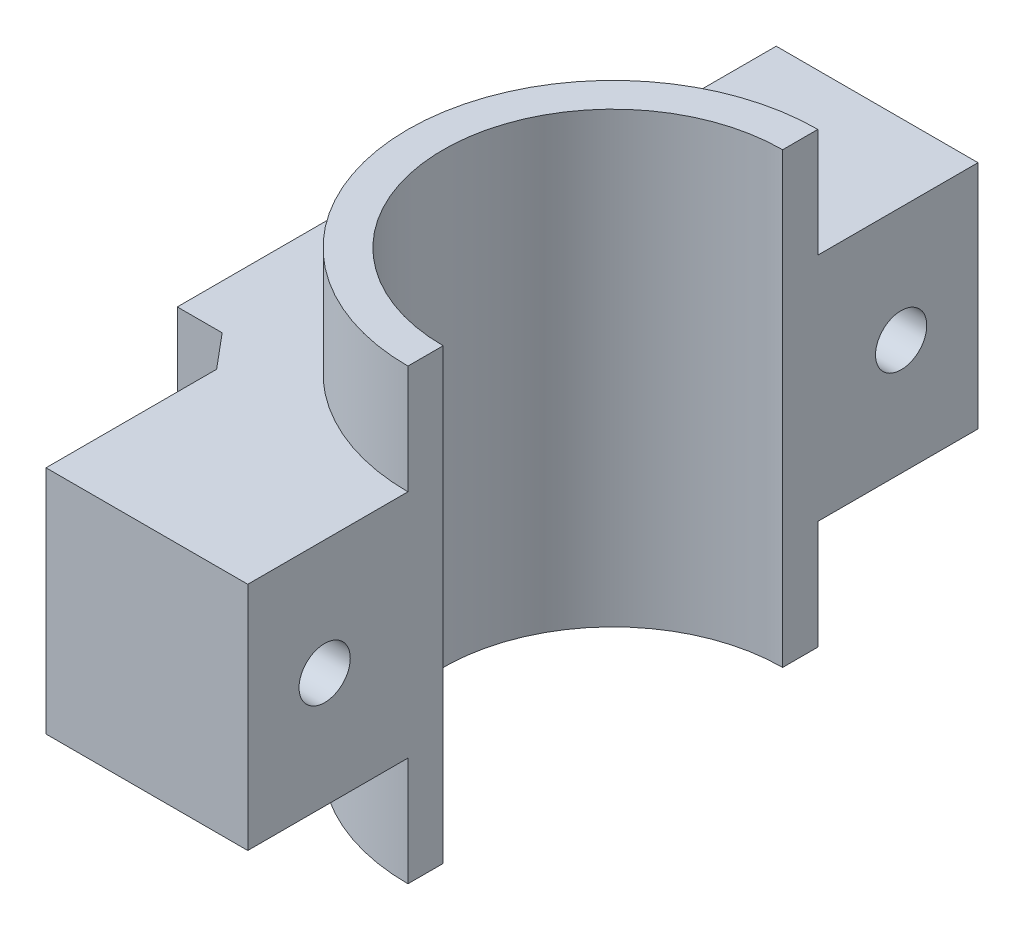
ISO-10303-21;
HEADER;
FILE_DESCRIPTION(('STEP AP214'),'2;1');
FILE_NAME('part.step','',(''),(''),'','','');
FILE_SCHEMA(('AUTOMOTIVE_DESIGN { 1 0 10303 214 1 1 1 1 }'));
ENDSEC;
DATA;
#1=APPLICATION_CONTEXT('core data for automotive mechanical design processes');
#2=APPLICATION_PROTOCOL_DEFINITION('international standard','automotive_design',2000,#1);
#3=PRODUCT_CONTEXT('',#1,'mechanical');
#4=PRODUCT('Part','Part','',(#3));
#5=PRODUCT_RELATED_PRODUCT_CATEGORY('part','',(#4));
#6=PRODUCT_DEFINITION_FORMATION('','',#4);
#7=PRODUCT_DEFINITION_CONTEXT('part definition',#1,'design');
#8=PRODUCT_DEFINITION('design','',#6,#7);
#9=PRODUCT_DEFINITION_SHAPE('','',#8);
#10=(LENGTH_UNIT() NAMED_UNIT(*) SI_UNIT(.MILLI.,.METRE.));
#11=(NAMED_UNIT(*) PLANE_ANGLE_UNIT() SI_UNIT($,.RADIAN.));
#12=(NAMED_UNIT(*) SI_UNIT($,.STERADIAN.) SOLID_ANGLE_UNIT());
#13=UNCERTAINTY_MEASURE_WITH_UNIT(LENGTH_MEASURE(1.E-05),#10,'distance_accuracy_value','');
#14=(GEOMETRIC_REPRESENTATION_CONTEXT(3) GLOBAL_UNCERTAINTY_ASSIGNED_CONTEXT((#13)) GLOBAL_UNIT_ASSIGNED_CONTEXT((#10,
#11,#12)) REPRESENTATION_CONTEXT('',''));
#15=CARTESIAN_POINT('',(0.,0.,0.));
#16=DIRECTION('',(0.,0.,1.));
#17=DIRECTION('',(1.,0.,0.));
#18=AXIS2_PLACEMENT_3D('',#15,#16,#17);
#19=CARTESIAN_POINT('',(0.,18.,0.));
#20=DIRECTION('',(-1.,0.,0.));
#21=DIRECTION('',(0.,0.,1.));
#22=AXIS2_PLACEMENT_3D('',#19,#20,#21);
#23=PLANE('',#22);
#24=DIRECTION('',(0.,0.,-1.));
#25=VECTOR('',#24,1.);
#26=CARTESIAN_POINT('',(0.,-18.,0.));
#27=LINE('',#26,#25);
#28=CARTESIAN_POINT('',(0.,-18.,-32.));
#29=VERTEX_POINT('',#28);
#30=CARTESIAN_POINT('',(0.,-18.,-57.));
#31=VERTEX_POINT('',#30);
#32=EDGE_CURVE('E161',#29,#31,#27,.T.);
#33=ORIENTED_EDGE('',*,*,#32,.T.);
#34=DIRECTION('',(0.,-1.,0.));
#35=VECTOR('',#34,1.);
#36=CARTESIAN_POINT('',(0.,18.,-57.));
#37=LINE('',#36,#35);
#38=CARTESIAN_POINT('',(0.,18.,-57.));
#39=VERTEX_POINT('',#38);
#40=EDGE_CURVE('E11',#39,#31,#37,.T.);
#41=ORIENTED_EDGE('',*,*,#40,.F.);
#42=DIRECTION('',(0.,0.,-1.));
#43=VECTOR('',#42,1.);
#44=CARTESIAN_POINT('',(0.,18.,0.));
#45=LINE('',#44,#43);
#46=CARTESIAN_POINT('',(0.,18.,-32.));
#47=VERTEX_POINT('',#46);
#48=EDGE_CURVE('E459',#47,#39,#45,.T.);
#49=ORIENTED_EDGE('',*,*,#48,.F.);
#50=DIRECTION('',(0.,-1.,0.));
#51=VECTOR('',#50,1.);
#52=CARTESIAN_POINT('',(0.,35.,-32.));
#53=LINE('',#52,#51);
#54=CARTESIAN_POINT('',(0.,35.,-32.));
#55=VERTEX_POINT('',#54);
#56=EDGE_CURVE('E444',#55,#47,#53,.T.);
#57=ORIENTED_EDGE('',*,*,#56,.F.);
#58=DIRECTION('',(0.,0.,-1.));
#59=VECTOR('',#58,1.);
#60=CARTESIAN_POINT('',(0.,35.,0.));
#61=LINE('',#60,#59);
#62=CARTESIAN_POINT('',(0.,35.,-26.5));
#63=VERTEX_POINT('',#62);
#64=EDGE_CURVE('E430',#63,#55,#61,.T.);
#65=ORIENTED_EDGE('',*,*,#64,.F.);
#66=DIRECTION('',(0.,-1.,0.));
#67=VECTOR('',#66,1.);
#68=CARTESIAN_POINT('',(0.,35.,-26.5));
#69=LINE('',#68,#67);
#70=CARTESIAN_POINT('',(0.,-35.,-26.5));
#71=VERTEX_POINT('',#70);
#72=EDGE_CURVE('E447',#63,#71,#69,.T.);
#73=ORIENTED_EDGE('',*,*,#72,.T.);
#74=DIRECTION('',(0.,0.,-1.));
#75=VECTOR('',#74,1.);
#76=CARTESIAN_POINT('',(0.,-35.,0.));
#77=LINE('',#76,#75);
#78=CARTESIAN_POINT('',(0.,-35.,-32.));
#79=VERTEX_POINT('',#78);
#80=EDGE_CURVE('E424',#71,#79,#77,.T.);
#81=ORIENTED_EDGE('',*,*,#80,.T.);
#82=EDGE_CURVE('E433',#29,#79,#53,.T.);
#83=ORIENTED_EDGE('',*,*,#82,.F.);
#84=EDGE_LOOP('',(#33,#41,#49,#57,#65,#73,#81,#83));
#85=FACE_BOUND('',#84,.T.);
#86=CARTESIAN_POINT('',(-1.66533453693773E-13,0.,-45.));
#87=DIRECTION('',(-1.,0.,0.));
#88=DIRECTION('',(0.,0.,1.));
#89=AXIS2_PLACEMENT_3D('',#86,#87,#88);
#90=CIRCLE('',#89,4.00000000000001);
#91=CARTESIAN_POINT('',(-1.51730480032105E-13,0.,-41.));
#92=VERTEX_POINT('',#91);
#93=EDGE_CURVE('E406',#92,#92,#90,.T.);
#94=ORIENTED_EDGE('',*,*,#93,.T.);
#95=EDGE_LOOP('',(#94));
#96=FACE_BOUND('',#95,.T.);
#97=ADVANCED_FACE('F34',(#85,#96),#23,.F.);
#98=CARTESIAN_POINT('',(-31.5004867321942,18.,0.));
#99=DIRECTION('',(1.,0.,0.));
#100=DIRECTION('',(0.,0.,-1.));
#101=AXIS2_PLACEMENT_3D('',#98,#99,#100);
#102=PLANE('',#101);
#103=DIRECTION('',(0.,0.,1.));
#104=VECTOR('',#103,1.);
#105=CARTESIAN_POINT('',(-31.5004867321942,-18.,0.));
#106=LINE('',#105,#104);
#107=CARTESIAN_POINT('',(-31.5004867321942,-18.,-57.));
#108=VERTEX_POINT('',#107);
#109=CARTESIAN_POINT('',(-31.5004867321942,-18.,-30.3623111018329));
#110=VERTEX_POINT('',#109);
#111=EDGE_CURVE('E165',#108,#110,#106,.T.);
#112=ORIENTED_EDGE('',*,*,#111,.T.);
#113=DIRECTION('',(0.,-1.,0.));
#114=VECTOR('',#113,1.);
#115=CARTESIAN_POINT('',(-31.5004867321942,18.,-30.3623111018329));
#116=LINE('',#115,#114);
#117=CARTESIAN_POINT('',(-31.5004867321942,18.,-30.3623111018329));
#118=VERTEX_POINT('',#117);
#119=EDGE_CURVE('E194',#118,#110,#116,.T.);
#120=ORIENTED_EDGE('',*,*,#119,.F.);
#121=DIRECTION('',(0.,0.,1.));
#122=VECTOR('',#121,1.);
#123=CARTESIAN_POINT('',(-31.5004867321942,18.,0.));
#124=LINE('',#123,#122);
#125=CARTESIAN_POINT('',(-31.5004867321942,18.,-57.));
#126=VERTEX_POINT('',#125);
#127=EDGE_CURVE('E203',#126,#118,#124,.T.);
#128=ORIENTED_EDGE('',*,*,#127,.F.);
#129=DIRECTION('',(0.,-1.,0.));
#130=VECTOR('',#129,1.);
#131=CARTESIAN_POINT('',(-31.5004867321942,18.,-57.));
#132=LINE('',#131,#130);
#133=EDGE_CURVE('E43',#126,#108,#132,.T.);
#134=ORIENTED_EDGE('',*,*,#133,.T.);
#135=EDGE_LOOP('',(#112,#120,#128,#134));
#136=FACE_BOUND('',#135,.T.);
#137=CARTESIAN_POINT('',(-31.5004867321942,0.,-44.9999999999999));
#138=DIRECTION('',(1.,0.,0.));
#139=DIRECTION('',(0.,0.,-1.));
#140=AXIS2_PLACEMENT_3D('',#137,#138,#139);
#141=CIRCLE('',#140,4.00000000000001);
#142=CARTESIAN_POINT('',(-31.5004867321942,0.,-48.9999999999999));
#143=VERTEX_POINT('',#142);
#144=EDGE_CURVE('E409',#143,#143,#141,.T.);
#145=ORIENTED_EDGE('',*,*,#144,.T.);
#146=EDGE_LOOP('',(#145));
#147=FACE_BOUND('',#146,.T.);
#148=ADVANCED_FACE('F200',(#136,#147),#102,.F.);
#149=CARTESIAN_POINT('',(0.,18.,0.));
#150=DIRECTION('',(1.,0.,0.));
#151=DIRECTION('',(0.,0.,-1.));
#152=AXIS2_PLACEMENT_3D('',#149,#150,#151);
#153=PLANE('',#152);
#154=CARTESIAN_POINT('',(-1.66533453693773E-13,0.,45.));
#155=DIRECTION('',(1.,0.,0.));
#156=DIRECTION('',(0.,0.,-1.));
#157=AXIS2_PLACEMENT_3D('',#154,#155,#156);
#158=CIRCLE('',#157,4.00000000000001);
#159=CARTESIAN_POINT('',(-1.51730480032105E-13,0.,41.));
#160=VERTEX_POINT('',#159);
#161=EDGE_CURVE('E414',#160,#160,#158,.T.);
#162=ORIENTED_EDGE('',*,*,#161,.F.);
#163=EDGE_LOOP('',(#162));
#164=FACE_BOUND('',#163,.T.);
#165=DIRECTION('',(0.,0.,1.));
#166=VECTOR('',#165,1.);
#167=CARTESIAN_POINT('',(0.,-18.,0.));
#168=LINE('',#167,#166);
#169=CARTESIAN_POINT('',(0.,-18.,32.));
#170=VERTEX_POINT('',#169);
#171=CARTESIAN_POINT('',(0.,-18.,57.));
#172=VERTEX_POINT('',#171);
#173=EDGE_CURVE('E155',#170,#172,#168,.T.);
#174=ORIENTED_EDGE('',*,*,#173,.F.);
#175=DIRECTION('',(0.,-1.,0.));
#176=VECTOR('',#175,1.);
#177=CARTESIAN_POINT('',(0.,35.,32.));
#178=LINE('',#177,#176);
#179=CARTESIAN_POINT('',(0.,-35.,32.));
#180=VERTEX_POINT('',#179);
#181=EDGE_CURVE('E453',#170,#180,#178,.T.);
#182=ORIENTED_EDGE('',*,*,#181,.T.);
#183=DIRECTION('',(0.,0.,1.));
#184=VECTOR('',#183,1.);
#185=CARTESIAN_POINT('',(0.,-35.,0.));
#186=LINE('',#185,#184);
#187=CARTESIAN_POINT('',(0.,-35.,26.5));
#188=VERTEX_POINT('',#187);
#189=EDGE_CURVE('E436',#188,#180,#186,.T.);
#190=ORIENTED_EDGE('',*,*,#189,.F.);
#191=DIRECTION('',(0.,-1.,0.));
#192=VECTOR('',#191,1.);
#193=CARTESIAN_POINT('',(0.,35.,26.5));
#194=LINE('',#193,#192);
#195=CARTESIAN_POINT('',(0.,35.,26.5));
#196=VERTEX_POINT('',#195);
#197=EDGE_CURVE('E450',#196,#188,#194,.T.);
#198=ORIENTED_EDGE('',*,*,#197,.F.);
#199=DIRECTION('',(0.,0.,1.));
#200=VECTOR('',#199,1.);
#201=CARTESIAN_POINT('',(0.,35.,0.));
#202=LINE('',#201,#200);
#203=CARTESIAN_POINT('',(0.,35.,32.));
#204=VERTEX_POINT('',#203);
#205=EDGE_CURVE('E423',#196,#204,#202,.T.);
#206=ORIENTED_EDGE('',*,*,#205,.T.);
#207=CARTESIAN_POINT('',(0.,18.,32.));
#208=VERTEX_POINT('',#207);
#209=EDGE_CURVE('E158',#204,#208,#178,.T.);
#210=ORIENTED_EDGE('',*,*,#209,.T.);
#211=DIRECTION('',(0.,0.,1.));
#212=VECTOR('',#211,1.);
#213=CARTESIAN_POINT('',(0.,18.,0.));
#214=LINE('',#213,#212);
#215=CARTESIAN_POINT('',(0.,18.,57.));
#216=VERTEX_POINT('',#215);
#217=EDGE_CURVE('E99',#208,#216,#214,.T.);
#218=ORIENTED_EDGE('',*,*,#217,.T.);
#219=DIRECTION('',(0.,-1.,0.));
#220=VECTOR('',#219,1.);
#221=CARTESIAN_POINT('',(0.,18.,57.));
#222=LINE('',#221,#220);
#223=EDGE_CURVE('E51',#216,#172,#222,.T.);
#224=ORIENTED_EDGE('',*,*,#223,.T.);
#225=EDGE_LOOP('',(#174,#182,#190,#198,#206,#210,#218,#224));
#226=FACE_BOUND('',#225,.T.);
#227=ADVANCED_FACE('F36',(#164,#226),#153,.T.);
#228=CARTESIAN_POINT('',(0.,18.,-57.));
#229=DIRECTION('',(0.,0.,1.));
#230=DIRECTION('',(1.,0.,0.));
#231=AXIS2_PLACEMENT_3D('',#228,#229,#230);
#232=PLANE('',#231);
#233=DIRECTION('',(-1.,0.,0.));
#234=VECTOR('',#233,1.);
#235=CARTESIAN_POINT('',(0.,-18.,-57.));
#236=LINE('',#235,#234);
#237=EDGE_CURVE('E163',#31,#108,#236,.T.);
#238=ORIENTED_EDGE('',*,*,#237,.T.);
#239=ORIENTED_EDGE('',*,*,#133,.F.);
#240=DIRECTION('',(-1.,0.,0.));
#241=VECTOR('',#240,1.);
#242=CARTESIAN_POINT('',(0.,18.,-57.));
#243=LINE('',#242,#241);
#244=EDGE_CURVE('E223',#39,#126,#243,.T.);
#245=ORIENTED_EDGE('',*,*,#244,.F.);
#246=ORIENTED_EDGE('',*,*,#40,.T.);
#247=EDGE_LOOP('',(#238,#239,#245,#246));
#248=FACE_BOUND('',#247,.T.);
#249=ADVANCED_FACE('F252',(#248),#232,.F.);
#250=CARTESIAN_POINT('',(-33.4357641106574,18.,-28.0559373333831));
#251=DIRECTION('',(-0.766044443118979,0.,-0.642787609686538));
#252=DIRECTION('',(-0.642787609686538,0.,0.766044443118979));
#253=AXIS2_PLACEMENT_3D('',#250,#251,#252);
#254=PLANE('',#253);
#255=DIRECTION('',(0.642787609686538,0.,-0.766044443118979));
#256=VECTOR('',#255,1.);
#257=CARTESIAN_POINT('',(-33.4357641106574,-18.,-28.0559373333831));
#258=LINE('',#257,#256);
#259=CARTESIAN_POINT('',(-36.,-18.,-25.));
#260=VERTEX_POINT('',#259);
#261=EDGE_CURVE('E168',#260,#110,#258,.T.);
#262=ORIENTED_EDGE('',*,*,#261,.F.);
#263=DIRECTION('',(0.,-1.,0.));
#264=VECTOR('',#263,1.);
#265=CARTESIAN_POINT('',(-36.,18.,-25.));
#266=LINE('',#265,#264);
#267=CARTESIAN_POINT('',(-36.,18.,-25.));
#268=VERTEX_POINT('',#267);
#269=EDGE_CURVE('E192',#268,#260,#266,.T.);
#270=ORIENTED_EDGE('',*,*,#269,.F.);
#271=DIRECTION('',(0.642787609686538,0.,-0.766044443118979));
#272=VECTOR('',#271,1.);
#273=CARTESIAN_POINT('',(-33.4357641106574,18.,-28.0559373333831));
#274=LINE('',#273,#272);
#275=EDGE_CURVE('E216',#268,#118,#274,.T.);
#276=ORIENTED_EDGE('',*,*,#275,.T.);
#277=ORIENTED_EDGE('',*,*,#119,.T.);
#278=EDGE_LOOP('',(#262,#270,#276,#277));
#279=FACE_BOUND('',#278,.T.);
#280=ADVANCED_FACE('F213',(#279),#254,.T.);
#281=CARTESIAN_POINT('',(0.,18.,-25.));
#282=DIRECTION('',(0.,0.,-1.));
#283=DIRECTION('',(-1.,0.,0.));
#284=AXIS2_PLACEMENT_3D('',#281,#282,#283);
#285=PLANE('',#284);
#286=DIRECTION('',(1.,0.,0.));
#287=VECTOR('',#286,1.);
#288=CARTESIAN_POINT('',(0.,-18.,-25.));
#289=LINE('',#288,#287);
#290=CARTESIAN_POINT('',(-43.,-18.,-25.));
#291=VERTEX_POINT('',#290);
#292=EDGE_CURVE('E171',#291,#260,#289,.T.);
#293=ORIENTED_EDGE('',*,*,#292,.F.);
#294=DIRECTION('',(0.,-1.,0.));
#295=VECTOR('',#294,1.);
#296=CARTESIAN_POINT('',(-43.,18.,-25.));
#297=LINE('',#296,#295);
#298=CARTESIAN_POINT('',(-43.,18.,-25.));
#299=VERTEX_POINT('',#298);
#300=EDGE_CURVE('E190',#299,#291,#297,.T.);
#301=ORIENTED_EDGE('',*,*,#300,.F.);
#302=DIRECTION('',(1.,0.,0.));
#303=VECTOR('',#302,1.);
#304=CARTESIAN_POINT('',(0.,18.,-25.));
#305=LINE('',#304,#303);
#306=EDGE_CURVE('E219',#299,#268,#305,.T.);
#307=ORIENTED_EDGE('',*,*,#306,.T.);
#308=ORIENTED_EDGE('',*,*,#269,.T.);
#309=EDGE_LOOP('',(#293,#301,#307,#308));
#310=FACE_BOUND('',#309,.T.);
#311=ADVANCED_FACE('F232',(#310),#285,.T.);
#312=CARTESIAN_POINT('',(-43.,18.,0.));
#313=DIRECTION('',(-1.,0.,0.));
#314=DIRECTION('',(0.,0.,1.));
#315=AXIS2_PLACEMENT_3D('',#312,#313,#314);
#316=PLANE('',#315);
#317=DIRECTION('',(0.,0.,-1.));
#318=VECTOR('',#317,1.);
#319=CARTESIAN_POINT('',(-43.,-18.,0.));
#320=LINE('',#319,#318);
#321=CARTESIAN_POINT('',(-43.,-18.,25.));
#322=VERTEX_POINT('',#321);
#323=EDGE_CURVE('E174',#322,#291,#320,.T.);
#324=ORIENTED_EDGE('',*,*,#323,.F.);
#325=DIRECTION('',(0.,-1.,0.));
#326=VECTOR('',#325,1.);
#327=CARTESIAN_POINT('',(-43.,18.,25.));
#328=LINE('',#327,#326);
#329=CARTESIAN_POINT('',(-43.,18.,25.));
#330=VERTEX_POINT('',#329);
#331=EDGE_CURVE('E188',#330,#322,#328,.T.);
#332=ORIENTED_EDGE('',*,*,#331,.F.);
#333=DIRECTION('',(0.,0.,-1.));
#334=VECTOR('',#333,1.);
#335=CARTESIAN_POINT('',(-43.,18.,0.));
#336=LINE('',#335,#334);
#337=EDGE_CURVE('E221',#330,#299,#336,.T.);
#338=ORIENTED_EDGE('',*,*,#337,.T.);
#339=ORIENTED_EDGE('',*,*,#300,.T.);
#340=EDGE_LOOP('',(#324,#332,#338,#339));
#341=FACE_BOUND('',#340,.T.);
#342=ADVANCED_FACE('F230',(#341),#316,.T.);
#343=CARTESIAN_POINT('',(0.,18.,25.));
#344=DIRECTION('',(0.,0.,-1.));
#345=DIRECTION('',(-1.,0.,0.));
#346=AXIS2_PLACEMENT_3D('',#343,#344,#345);
#347=PLANE('',#346);
#348=DIRECTION('',(1.,0.,0.));
#349=VECTOR('',#348,1.);
#350=CARTESIAN_POINT('',(0.,-18.,25.));
#351=LINE('',#350,#349);
#352=CARTESIAN_POINT('',(-36.,-18.,25.));
#353=VERTEX_POINT('',#352);
#354=EDGE_CURVE('E177',#322,#353,#351,.T.);
#355=ORIENTED_EDGE('',*,*,#354,.T.);
#356=DIRECTION('',(0.,-1.,0.));
#357=VECTOR('',#356,1.);
#358=CARTESIAN_POINT('',(-36.,18.,25.));
#359=LINE('',#358,#357);
#360=CARTESIAN_POINT('',(-36.,18.,25.));
#361=VERTEX_POINT('',#360);
#362=EDGE_CURVE('E147',#361,#353,#359,.T.);
#363=ORIENTED_EDGE('',*,*,#362,.F.);
#364=DIRECTION('',(1.,0.,0.));
#365=VECTOR('',#364,1.);
#366=CARTESIAN_POINT('',(0.,18.,25.));
#367=LINE('',#366,#365);
#368=EDGE_CURVE('E135',#330,#361,#367,.T.);
#369=ORIENTED_EDGE('',*,*,#368,.F.);
#370=ORIENTED_EDGE('',*,*,#331,.T.);
#371=EDGE_LOOP('',(#355,#363,#369,#370));
#372=FACE_BOUND('',#371,.T.);
#373=ADVANCED_FACE('F235',(#372),#347,.F.);
#374=CARTESIAN_POINT('',(-33.4357641106574,18.,28.0559373333831));
#375=DIRECTION('',(0.766044443118979,0.,-0.642787609686538));
#376=DIRECTION('',(-0.642787609686538,0.,-0.766044443118979));
#377=AXIS2_PLACEMENT_3D('',#374,#375,#376);
#378=PLANE('',#377);
#379=DIRECTION('',(0.642787609686538,0.,0.766044443118979));
#380=VECTOR('',#379,1.);
#381=CARTESIAN_POINT('',(-33.4357641106574,-18.,28.0559373333831));
#382=LINE('',#381,#380);
#383=CARTESIAN_POINT('',(-31.5004867321943,-18.,30.3623111018329));
#384=VERTEX_POINT('',#383);
#385=EDGE_CURVE('E144',#353,#384,#382,.T.);
#386=ORIENTED_EDGE('',*,*,#385,.T.);
#387=DIRECTION('',(0.,-1.,0.));
#388=VECTOR('',#387,1.);
#389=CARTESIAN_POINT('',(-31.5004867321943,18.,30.3623111018329));
#390=LINE('',#389,#388);
#391=CARTESIAN_POINT('',(-31.5004867321943,18.,30.3623111018329));
#392=VERTEX_POINT('',#391);
#393=EDGE_CURVE('E141',#392,#384,#390,.T.);
#394=ORIENTED_EDGE('',*,*,#393,.F.);
#395=DIRECTION('',(0.642787609686538,0.,0.766044443118979));
#396=VECTOR('',#395,1.);
#397=CARTESIAN_POINT('',(-33.4357641106574,18.,28.0559373333831));
#398=LINE('',#397,#396);
#399=EDGE_CURVE('E128',#361,#392,#398,.T.);
#400=ORIENTED_EDGE('',*,*,#399,.F.);
#401=ORIENTED_EDGE('',*,*,#362,.T.);
#402=EDGE_LOOP('',(#386,#394,#400,#401));
#403=FACE_BOUND('',#402,.T.);
#404=ADVANCED_FACE('F142',(#403),#378,.F.);
#405=CARTESIAN_POINT('',(-31.5004867321943,18.,0.));
#406=DIRECTION('',(-1.,0.,0.));
#407=DIRECTION('',(0.,0.,1.));
#408=AXIS2_PLACEMENT_3D('',#405,#406,#407);
#409=PLANE('',#408);
#410=CARTESIAN_POINT('',(-31.5004867321942,0.,44.9999999999999));
#411=DIRECTION('',(-1.,0.,0.));
#412=DIRECTION('',(0.,0.,1.));
#413=AXIS2_PLACEMENT_3D('',#410,#411,#412);
#414=CIRCLE('',#413,4.00000000000001);
#415=CARTESIAN_POINT('',(-31.5004867321942,0.,48.9999999999999));
#416=VERTEX_POINT('',#415);
#417=EDGE_CURVE('E411',#416,#416,#414,.F.);
#418=ORIENTED_EDGE('',*,*,#417,.T.);
#419=EDGE_LOOP('',(#418));
#420=FACE_BOUND('',#419,.T.);
#421=DIRECTION('',(0.,0.,-1.));
#422=VECTOR('',#421,1.);
#423=CARTESIAN_POINT('',(-31.5004867321943,-18.,0.));
#424=LINE('',#423,#422);
#425=CARTESIAN_POINT('',(-31.5004867321942,-18.,57.));
#426=VERTEX_POINT('',#425);
#427=EDGE_CURVE('E180',#426,#384,#424,.T.);
#428=ORIENTED_EDGE('',*,*,#427,.F.);
#429=DIRECTION('',(0.,-1.,0.));
#430=VECTOR('',#429,1.);
#431=CARTESIAN_POINT('',(-31.5004867321942,18.,57.));
#432=LINE('',#431,#430);
#433=CARTESIAN_POINT('',(-31.5004867321942,18.,57.));
#434=VERTEX_POINT('',#433);
#435=EDGE_CURVE('E87',#434,#426,#432,.T.);
#436=ORIENTED_EDGE('',*,*,#435,.F.);
#437=DIRECTION('',(0.,0.,-1.));
#438=VECTOR('',#437,1.);
#439=CARTESIAN_POINT('',(-31.5004867321943,18.,0.));
#440=LINE('',#439,#438);
#441=EDGE_CURVE('E132',#434,#392,#440,.T.);
#442=ORIENTED_EDGE('',*,*,#441,.T.);
#443=ORIENTED_EDGE('',*,*,#393,.T.);
#444=EDGE_LOOP('',(#428,#436,#442,#443));
#445=FACE_BOUND('',#444,.T.);
#446=ADVANCED_FACE('F149',(#420,#445),#409,.T.);
#447=CARTESIAN_POINT('',(0.,18.,57.));
#448=DIRECTION('',(0.,0.,1.));
#449=DIRECTION('',(1.,0.,0.));
#450=AXIS2_PLACEMENT_3D('',#447,#448,#449);
#451=PLANE('',#450);
#452=DIRECTION('',(-1.,0.,0.));
#453=VECTOR('',#452,1.);
#454=CARTESIAN_POINT('',(0.,-18.,57.));
#455=LINE('',#454,#453);
#456=EDGE_CURVE('E182',#172,#426,#455,.T.);
#457=ORIENTED_EDGE('',*,*,#456,.F.);
#458=ORIENTED_EDGE('',*,*,#223,.F.);
#459=DIRECTION('',(-1.,0.,0.));
#460=VECTOR('',#459,1.);
#461=CARTESIAN_POINT('',(0.,18.,57.));
#462=LINE('',#461,#460);
#463=EDGE_CURVE('E150',#216,#434,#462,.T.);
#464=ORIENTED_EDGE('',*,*,#463,.T.);
#465=ORIENTED_EDGE('',*,*,#435,.T.);
#466=EDGE_LOOP('',(#457,#458,#464,#465));
#467=FACE_BOUND('',#466,.T.);
#468=ADVANCED_FACE('F283',(#467),#451,.T.);
#469=CARTESIAN_POINT('',(0.,18.,0.));
#470=DIRECTION('',(0.,1.,0.));
#471=DIRECTION('',(0.,0.,1.));
#472=AXIS2_PLACEMENT_3D('',#469,#470,#471);
#473=PLANE('',#472);
#474=ORIENTED_EDGE('',*,*,#217,.F.);
#475=CARTESIAN_POINT('',(0.,18.,0.));
#476=DIRECTION('',(0.,1.,0.));
#477=DIRECTION('',(0.,0.,1.));
#478=AXIS2_PLACEMENT_3D('',#475,#476,#477);
#479=CIRCLE('',#478,32.);
#480=EDGE_CURVE('E457',#208,#47,#479,.F.);
#481=ORIENTED_EDGE('',*,*,#480,.T.);
#482=ORIENTED_EDGE('',*,*,#48,.T.);
#483=ORIENTED_EDGE('',*,*,#244,.T.);
#484=ORIENTED_EDGE('',*,*,#127,.T.);
#485=ORIENTED_EDGE('',*,*,#275,.F.);
#486=ORIENTED_EDGE('',*,*,#306,.F.);
#487=ORIENTED_EDGE('',*,*,#337,.F.);
#488=ORIENTED_EDGE('',*,*,#368,.T.);
#489=ORIENTED_EDGE('',*,*,#399,.T.);
#490=ORIENTED_EDGE('',*,*,#441,.F.);
#491=ORIENTED_EDGE('',*,*,#463,.F.);
#492=EDGE_LOOP('',(#474,#481,#482,#483,#484,#485,#486,#487,#488,#489,#490,#491));
#493=FACE_BOUND('',#492,.T.);
#494=ADVANCED_FACE('F130',(#493),#473,.T.);
#495=CARTESIAN_POINT('',(0.,-18.,0.));
#496=DIRECTION('',(0.,1.,0.));
#497=DIRECTION('',(0.,0.,1.));
#498=AXIS2_PLACEMENT_3D('',#495,#496,#497);
#499=PLANE('',#498);
#500=ORIENTED_EDGE('',*,*,#173,.T.);
#501=ORIENTED_EDGE('',*,*,#456,.T.);
#502=ORIENTED_EDGE('',*,*,#427,.T.);
#503=ORIENTED_EDGE('',*,*,#385,.F.);
#504=ORIENTED_EDGE('',*,*,#354,.F.);
#505=ORIENTED_EDGE('',*,*,#323,.T.);
#506=ORIENTED_EDGE('',*,*,#292,.T.);
#507=ORIENTED_EDGE('',*,*,#261,.T.);
#508=ORIENTED_EDGE('',*,*,#111,.F.);
#509=ORIENTED_EDGE('',*,*,#237,.F.);
#510=ORIENTED_EDGE('',*,*,#32,.F.);
#511=CARTESIAN_POINT('',(0.,-18.,0.));
#512=DIRECTION('',(0.,1.,0.));
#513=DIRECTION('',(0.,0.,1.));
#514=AXIS2_PLACEMENT_3D('',#511,#512,#513);
#515=CIRCLE('',#514,32.);
#516=EDGE_CURVE('E157',#170,#29,#515,.F.);
#517=ORIENTED_EDGE('',*,*,#516,.F.);
#518=EDGE_LOOP('',(#500,#501,#502,#503,#504,#505,#506,#507,#508,#509,#510,#517));
#519=FACE_BOUND('',#518,.T.);
#520=ADVANCED_FACE('F208',(#519),#499,.F.);
#521=CARTESIAN_POINT('',(0.,35.,0.));
#522=DIRECTION('',(0.,-1.,0.));
#523=DIRECTION('',(0.,0.,-1.));
#524=AXIS2_PLACEMENT_3D('',#521,#522,#523);
#525=CYLINDRICAL_SURFACE('',#524,32.);
#526=ORIENTED_EDGE('',*,*,#516,.T.);
#527=ORIENTED_EDGE('',*,*,#82,.T.);
#528=CARTESIAN_POINT('',(0.,-35.,0.));
#529=DIRECTION('',(0.,1.,0.));
#530=DIRECTION('',(0.,0.,1.));
#531=AXIS2_PLACEMENT_3D('',#528,#529,#530);
#532=CIRCLE('',#531,32.);
#533=EDGE_CURVE('E417',#180,#79,#532,.F.);
#534=ORIENTED_EDGE('',*,*,#533,.F.);
#535=ORIENTED_EDGE('',*,*,#181,.F.);
#536=EDGE_LOOP('',(#526,#527,#534,#535));
#537=FACE_BOUND('',#536,.T.);
#538=ADVANCED_FACE('F304',(#537),#525,.T.);
#539=ORIENTED_EDGE('',*,*,#56,.T.);
#540=ORIENTED_EDGE('',*,*,#480,.F.);
#541=ORIENTED_EDGE('',*,*,#209,.F.);
#542=CARTESIAN_POINT('',(0.,35.,0.));
#543=DIRECTION('',(0.,1.,0.));
#544=DIRECTION('',(0.,0.,1.));
#545=AXIS2_PLACEMENT_3D('',#542,#543,#544);
#546=CIRCLE('',#545,32.);
#547=EDGE_CURVE('E420',#204,#55,#546,.F.);
#548=ORIENTED_EDGE('',*,*,#547,.T.);
#549=EDGE_LOOP('',(#539,#540,#541,#548));
#550=FACE_BOUND('',#549,.T.);
#551=ADVANCED_FACE('F314',(#550),#525,.T.);
#552=CARTESIAN_POINT('',(0.,35.,0.));
#553=DIRECTION('',(0.,-1.,0.));
#554=DIRECTION('',(0.,0.,-1.));
#555=AXIS2_PLACEMENT_3D('',#552,#553,#554);
#556=CYLINDRICAL_SURFACE('',#555,26.5);
#557=CARTESIAN_POINT('',(0.,-35.,0.));
#558=DIRECTION('',(0.,1.,0.));
#559=DIRECTION('',(0.,0.,1.));
#560=AXIS2_PLACEMENT_3D('',#557,#558,#559);
#561=CIRCLE('',#560,26.5);
#562=EDGE_CURVE('E439',#188,#71,#561,.F.);
#563=ORIENTED_EDGE('',*,*,#562,.T.);
#564=ORIENTED_EDGE('',*,*,#72,.F.);
#565=CARTESIAN_POINT('',(0.,35.,0.));
#566=DIRECTION('',(0.,1.,0.));
#567=DIRECTION('',(0.,0.,1.));
#568=AXIS2_PLACEMENT_3D('',#565,#566,#567);
#569=CIRCLE('',#568,26.5);
#570=EDGE_CURVE('E427',#196,#63,#569,.F.);
#571=ORIENTED_EDGE('',*,*,#570,.F.);
#572=ORIENTED_EDGE('',*,*,#197,.T.);
#573=EDGE_LOOP('',(#563,#564,#571,#572));
#574=FACE_BOUND('',#573,.T.);
#575=ADVANCED_FACE('F324',(#574),#556,.F.);
#576=CARTESIAN_POINT('',(0.,35.,0.));
#577=DIRECTION('',(0.,1.,0.));
#578=DIRECTION('',(0.,0.,1.));
#579=AXIS2_PLACEMENT_3D('',#576,#577,#578);
#580=PLANE('',#579);
#581=ORIENTED_EDGE('',*,*,#547,.F.);
#582=ORIENTED_EDGE('',*,*,#205,.F.);
#583=ORIENTED_EDGE('',*,*,#570,.T.);
#584=ORIENTED_EDGE('',*,*,#64,.T.);
#585=EDGE_LOOP('',(#581,#582,#583,#584));
#586=FACE_BOUND('',#585,.T.);
#587=ADVANCED_FACE('F333',(#586),#580,.T.);
#588=CARTESIAN_POINT('',(0.,-35.,0.));
#589=DIRECTION('',(0.,1.,0.));
#590=DIRECTION('',(0.,0.,1.));
#591=AXIS2_PLACEMENT_3D('',#588,#589,#590);
#592=PLANE('',#591);
#593=ORIENTED_EDGE('',*,*,#533,.T.);
#594=ORIENTED_EDGE('',*,*,#80,.F.);
#595=ORIENTED_EDGE('',*,*,#562,.F.);
#596=ORIENTED_EDGE('',*,*,#189,.T.);
#597=EDGE_LOOP('',(#593,#594,#595,#596));
#598=FACE_BOUND('',#597,.T.);
#599=ADVANCED_FACE('F343',(#598),#592,.F.);
#600=CARTESIAN_POINT('',(-43.0010000000004,0.,44.9999999999998));
#601=DIRECTION('',(1.,0.,0.));
#602=DIRECTION('',(0.,0.,-1.));
#603=AXIS2_PLACEMENT_3D('',#600,#601,#602);
#604=CYLINDRICAL_SURFACE('',#603,4.00000000000001);
#605=ORIENTED_EDGE('',*,*,#417,.F.);
#606=EDGE_LOOP('',(#605));
#607=FACE_BOUND('',#606,.T.);
#608=ORIENTED_EDGE('',*,*,#161,.T.);
#609=EDGE_LOOP('',(#608));
#610=FACE_BOUND('',#609,.T.);
#611=ADVANCED_FACE('F353',(#607,#610),#604,.F.);
#612=CARTESIAN_POINT('',(-43.0010000000004,0.,-44.9999999999998));
#613=DIRECTION('',(1.,0.,0.));
#614=DIRECTION('',(0.,0.,-1.));
#615=AXIS2_PLACEMENT_3D('',#612,#613,#614);
#616=CYLINDRICAL_SURFACE('',#615,4.00000000000001);
#617=ORIENTED_EDGE('',*,*,#93,.F.);
#618=EDGE_LOOP('',(#617));
#619=FACE_BOUND('',#618,.T.);
#620=ORIENTED_EDGE('',*,*,#144,.F.);
#621=EDGE_LOOP('',(#620));
#622=FACE_BOUND('',#621,.T.);
#623=ADVANCED_FACE('F377',(#619,#622),#616,.F.);
#624=CLOSED_SHELL('',(#97,#148,#227,#249,#280,#311,#342,#373,#404,#446,#468,#494,#520,#538,#551,
#575,#587,#599,#611,#623));
#625=MANIFOLD_SOLID_BREP('B2',#624);
#626=ADVANCED_BREP_SHAPE_REPRESENTATION('',(#18,#625),#14);
#627=SHAPE_DEFINITION_REPRESENTATION(#9,#626);
ENDSEC;
END-ISO-10303-21;
